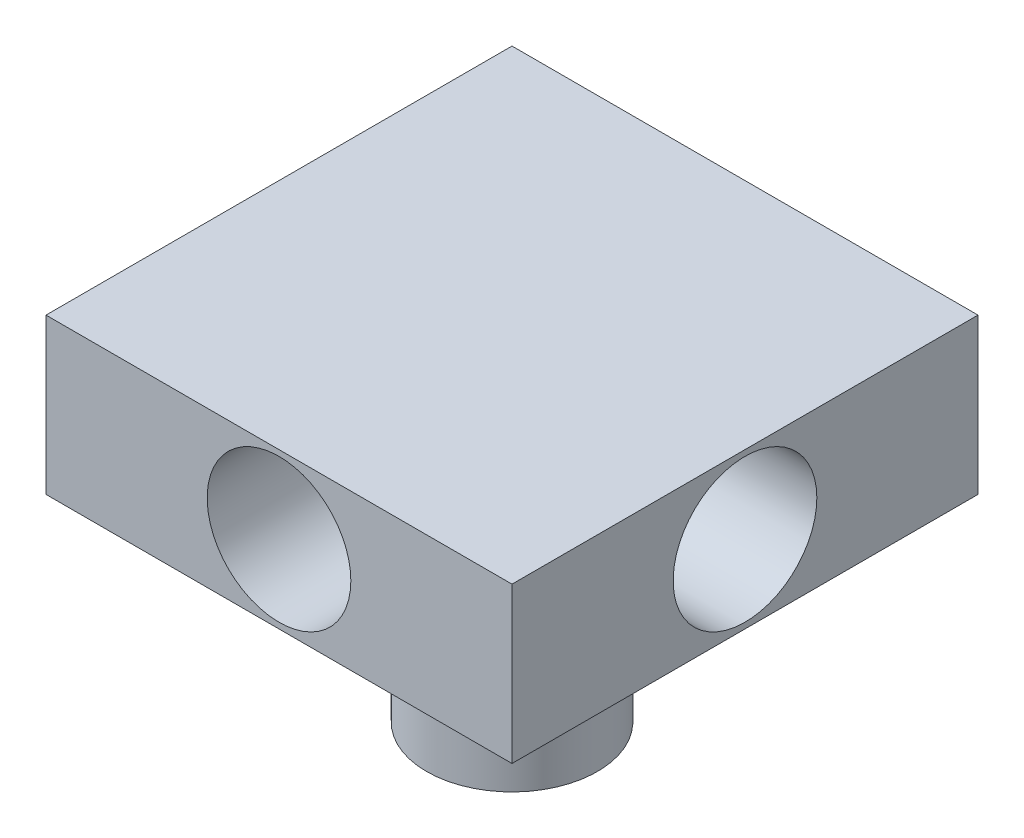
ISO-10303-21;
HEADER;
FILE_DESCRIPTION(('STEP AP214'),'2;1');
FILE_NAME('part.step','',(''),(''),'','','');
FILE_SCHEMA(('AUTOMOTIVE_DESIGN { 1 0 10303 214 1 1 1 1 }'));
ENDSEC;
DATA;
#1=APPLICATION_CONTEXT('core data for automotive mechanical design processes');
#2=APPLICATION_PROTOCOL_DEFINITION('international standard','automotive_design',2000,#1);
#3=PRODUCT_CONTEXT('',#1,'mechanical');
#4=PRODUCT('Part','Part','',(#3));
#5=PRODUCT_RELATED_PRODUCT_CATEGORY('part','',(#4));
#6=PRODUCT_DEFINITION_FORMATION('','',#4);
#7=PRODUCT_DEFINITION_CONTEXT('part definition',#1,'design');
#8=PRODUCT_DEFINITION('design','',#6,#7);
#9=PRODUCT_DEFINITION_SHAPE('','',#8);
#10=(LENGTH_UNIT() NAMED_UNIT(*) SI_UNIT(.MILLI.,.METRE.));
#11=(NAMED_UNIT(*) PLANE_ANGLE_UNIT() SI_UNIT($,.RADIAN.));
#12=(NAMED_UNIT(*) SI_UNIT($,.STERADIAN.) SOLID_ANGLE_UNIT());
#13=UNCERTAINTY_MEASURE_WITH_UNIT(LENGTH_MEASURE(1.E-05),#10,'distance_accuracy_value','');
#14=(GEOMETRIC_REPRESENTATION_CONTEXT(3) GLOBAL_UNCERTAINTY_ASSIGNED_CONTEXT((#13)) GLOBAL_UNIT_ASSIGNED_CONTEXT((#10,
#11,#12)) REPRESENTATION_CONTEXT('',''));
#15=CARTESIAN_POINT('',(0.,0.,0.));
#16=DIRECTION('',(0.,0.,1.));
#17=DIRECTION('',(1.,0.,0.));
#18=AXIS2_PLACEMENT_3D('',#15,#16,#17);
#19=CARTESIAN_POINT('',(0.,25.4,0.));
#20=DIRECTION('',(0.,-1.,0.));
#21=DIRECTION('',(0.,0.,-1.));
#22=AXIS2_PLACEMENT_3D('',#19,#20,#21);
#23=CYLINDRICAL_SURFACE('',#22,11.);
#24=CARTESIAN_POINT('',(0.,25.4,0.));
#25=DIRECTION('',(0.,1.,0.));
#26=DIRECTION('',(0.,0.,1.));
#27=AXIS2_PLACEMENT_3D('',#24,#25,#26);
#28=CIRCLE('',#27,11.);
#29=CARTESIAN_POINT('',(0.,25.4,11.));
#30=VERTEX_POINT('',#29);
#31=EDGE_CURVE('E11',#30,#30,#28,.T.);
#32=ORIENTED_EDGE('',*,*,#31,.F.);
#33=EDGE_LOOP('',(#32));
#34=FACE_BOUND('',#33,.T.);
#35=CARTESIAN_POINT('',(0.,0.,0.));
#36=DIRECTION('',(0.,1.,0.));
#37=DIRECTION('',(0.,0.,1.));
#38=AXIS2_PLACEMENT_3D('',#35,#36,#37);
#39=CIRCLE('',#38,11.);
#40=CARTESIAN_POINT('',(0.,0.,11.));
#41=VERTEX_POINT('',#40);
#42=EDGE_CURVE('E42',#41,#41,#39,.T.);
#43=ORIENTED_EDGE('',*,*,#42,.T.);
#44=EDGE_LOOP('',(#43));
#45=FACE_BOUND('',#44,.T.);
#46=ADVANCED_FACE('F39',(#34,#45),#23,.T.);
#47=CARTESIAN_POINT('',(0.,0.,0.));
#48=DIRECTION('',(0.,1.,0.));
#49=DIRECTION('',(0.,0.,1.));
#50=AXIS2_PLACEMENT_3D('',#47,#48,#49);
#51=PLANE('',#50);
#52=ORIENTED_EDGE('',*,*,#42,.F.);
#53=EDGE_LOOP('',(#52));
#54=FACE_BOUND('',#53,.T.);
#55=ADVANCED_FACE('F132',(#54),#51,.F.);
#56=CARTESIAN_POINT('',(-30.,45.4,30.));
#57=DIRECTION('',(1.,0.,0.));
#58=DIRECTION('',(0.,0.,-1.));
#59=AXIS2_PLACEMENT_3D('',#56,#57,#58);
#60=PLANE('',#59);
#61=CARTESIAN_POINT('',(-30.,35.4,0.));
#62=DIRECTION('',(-1.,0.,0.));
#63=DIRECTION('',(0.,0.,1.));
#64=AXIS2_PLACEMENT_3D('',#61,#62,#63);
#65=CIRCLE('',#64,9.25);
#66=CARTESIAN_POINT('',(-30.,35.4,9.25));
#67=VERTEX_POINT('',#66);
#68=EDGE_CURVE('E187',#67,#67,#65,.T.);
#69=ORIENTED_EDGE('',*,*,#68,.F.);
#70=EDGE_LOOP('',(#69));
#71=FACE_BOUND('',#70,.T.);
#72=DIRECTION('',(0.,0.,1.));
#73=VECTOR('',#72,1.);
#74=CARTESIAN_POINT('',(-30.,25.4,30.));
#75=LINE('',#74,#73);
#76=CARTESIAN_POINT('',(-30.,25.4,-30.));
#77=VERTEX_POINT('',#76);
#78=CARTESIAN_POINT('',(-30.,25.4,30.));
#79=VERTEX_POINT('',#78);
#80=EDGE_CURVE('E111',#77,#79,#75,.T.);
#81=ORIENTED_EDGE('',*,*,#80,.T.);
#82=DIRECTION('',(0.,-1.,0.));
#83=VECTOR('',#82,1.);
#84=CARTESIAN_POINT('',(-30.,45.4,30.));
#85=LINE('',#84,#83);
#86=CARTESIAN_POINT('',(-30.,45.4,30.));
#87=VERTEX_POINT('',#86);
#88=EDGE_CURVE('E100',#87,#79,#85,.T.);
#89=ORIENTED_EDGE('',*,*,#88,.F.);
#90=DIRECTION('',(0.,0.,1.));
#91=VECTOR('',#90,1.);
#92=CARTESIAN_POINT('',(-30.,45.4,30.));
#93=LINE('',#92,#91);
#94=CARTESIAN_POINT('',(-30.,45.4,-30.));
#95=VERTEX_POINT('',#94);
#96=EDGE_CURVE('E92',#95,#87,#93,.T.);
#97=ORIENTED_EDGE('',*,*,#96,.F.);
#98=DIRECTION('',(0.,-1.,0.));
#99=VECTOR('',#98,1.);
#100=CARTESIAN_POINT('',(-30.,45.4,-30.));
#101=LINE('',#100,#99);
#102=EDGE_CURVE('E107',#95,#77,#101,.T.);
#103=ORIENTED_EDGE('',*,*,#102,.T.);
#104=EDGE_LOOP('',(#81,#89,#97,#103));
#105=FACE_BOUND('',#104,.T.);
#106=ADVANCED_FACE('F134',(#71,#105),#60,.F.);
#107=CARTESIAN_POINT('',(30.,45.4,30.));
#108=DIRECTION('',(0.,0.,-1.));
#109=DIRECTION('',(-1.,0.,0.));
#110=AXIS2_PLACEMENT_3D('',#107,#108,#109);
#111=PLANE('',#110);
#112=CARTESIAN_POINT('',(0.,35.4,30.));
#113=DIRECTION('',(0.,0.,1.));
#114=DIRECTION('',(1.,0.,0.));
#115=AXIS2_PLACEMENT_3D('',#112,#113,#114);
#116=CIRCLE('',#115,9.25);
#117=CARTESIAN_POINT('',(9.25,35.4,30.));
#118=VERTEX_POINT('',#117);
#119=EDGE_CURVE('E200',#118,#118,#116,.T.);
#120=ORIENTED_EDGE('',*,*,#119,.F.);
#121=EDGE_LOOP('',(#120));
#122=FACE_BOUND('',#121,.T.);
#123=DIRECTION('',(1.,0.,0.));
#124=VECTOR('',#123,1.);
#125=CARTESIAN_POINT('',(30.,25.4,30.));
#126=LINE('',#125,#124);
#127=CARTESIAN_POINT('',(30.,25.4,30.));
#128=VERTEX_POINT('',#127);
#129=EDGE_CURVE('E98',#79,#128,#126,.T.);
#130=ORIENTED_EDGE('',*,*,#129,.T.);
#131=DIRECTION('',(0.,-1.,0.));
#132=VECTOR('',#131,1.);
#133=CARTESIAN_POINT('',(30.,45.4,30.));
#134=LINE('',#133,#132);
#135=CARTESIAN_POINT('',(30.,45.4,30.));
#136=VERTEX_POINT('',#135);
#137=EDGE_CURVE('E96',#136,#128,#134,.T.);
#138=ORIENTED_EDGE('',*,*,#137,.F.);
#139=DIRECTION('',(1.,0.,0.));
#140=VECTOR('',#139,1.);
#141=CARTESIAN_POINT('',(30.,45.4,30.));
#142=LINE('',#141,#140);
#143=EDGE_CURVE('E87',#87,#136,#142,.T.);
#144=ORIENTED_EDGE('',*,*,#143,.F.);
#145=ORIENTED_EDGE('',*,*,#88,.T.);
#146=EDGE_LOOP('',(#130,#138,#144,#145));
#147=FACE_BOUND('',#146,.T.);
#148=ADVANCED_FACE('F97',(#122,#147),#111,.F.);
#149=CARTESIAN_POINT('',(30.,45.4,30.));
#150=DIRECTION('',(-1.,0.,0.));
#151=DIRECTION('',(0.,0.,1.));
#152=AXIS2_PLACEMENT_3D('',#149,#150,#151);
#153=PLANE('',#152);
#154=CARTESIAN_POINT('',(30.,35.4,0.));
#155=DIRECTION('',(1.,0.,0.));
#156=DIRECTION('',(0.,0.,-1.));
#157=AXIS2_PLACEMENT_3D('',#154,#155,#156);
#158=CIRCLE('',#157,9.25);
#159=CARTESIAN_POINT('',(30.,35.4,-9.25));
#160=VERTEX_POINT('',#159);
#161=EDGE_CURVE('E188',#160,#160,#158,.T.);
#162=ORIENTED_EDGE('',*,*,#161,.F.);
#163=EDGE_LOOP('',(#162));
#164=FACE_BOUND('',#163,.T.);
#165=DIRECTION('',(0.,0.,-1.));
#166=VECTOR('',#165,1.);
#167=CARTESIAN_POINT('',(30.,25.4,30.));
#168=LINE('',#167,#166);
#169=CARTESIAN_POINT('',(30.,25.4,-30.));
#170=VERTEX_POINT('',#169);
#171=EDGE_CURVE('E73',#128,#170,#168,.T.);
#172=ORIENTED_EDGE('',*,*,#171,.T.);
#173=DIRECTION('',(0.,-1.,0.));
#174=VECTOR('',#173,1.);
#175=CARTESIAN_POINT('',(30.,45.4,-30.));
#176=LINE('',#175,#174);
#177=CARTESIAN_POINT('',(30.,45.4,-30.));
#178=VERTEX_POINT('',#177);
#179=EDGE_CURVE('E101',#178,#170,#176,.T.);
#180=ORIENTED_EDGE('',*,*,#179,.F.);
#181=DIRECTION('',(0.,0.,-1.));
#182=VECTOR('',#181,1.);
#183=CARTESIAN_POINT('',(30.,45.4,30.));
#184=LINE('',#183,#182);
#185=EDGE_CURVE('E90',#136,#178,#184,.T.);
#186=ORIENTED_EDGE('',*,*,#185,.F.);
#187=ORIENTED_EDGE('',*,*,#137,.T.);
#188=EDGE_LOOP('',(#172,#180,#186,#187));
#189=FACE_BOUND('',#188,.T.);
#190=ADVANCED_FACE('F103',(#164,#189),#153,.F.);
#191=CARTESIAN_POINT('',(30.,45.4,-30.));
#192=DIRECTION('',(0.,0.,1.));
#193=DIRECTION('',(1.,0.,0.));
#194=AXIS2_PLACEMENT_3D('',#191,#192,#193);
#195=PLANE('',#194);
#196=DIRECTION('',(-1.,0.,0.));
#197=VECTOR('',#196,1.);
#198=CARTESIAN_POINT('',(30.,25.4,-30.));
#199=LINE('',#198,#197);
#200=EDGE_CURVE('E79',#170,#77,#199,.T.);
#201=ORIENTED_EDGE('',*,*,#200,.T.);
#202=ORIENTED_EDGE('',*,*,#102,.F.);
#203=DIRECTION('',(-1.,0.,0.));
#204=VECTOR('',#203,1.);
#205=CARTESIAN_POINT('',(30.,45.4,-30.));
#206=LINE('',#205,#204);
#207=EDGE_CURVE('E56',#178,#95,#206,.T.);
#208=ORIENTED_EDGE('',*,*,#207,.F.);
#209=ORIENTED_EDGE('',*,*,#179,.T.);
#210=EDGE_LOOP('',(#201,#202,#208,#209));
#211=FACE_BOUND('',#210,.T.);
#212=ADVANCED_FACE('F148',(#211),#195,.F.);
#213=CARTESIAN_POINT('',(0.,45.4,0.));
#214=DIRECTION('',(0.,1.,0.));
#215=DIRECTION('',(0.,0.,1.));
#216=AXIS2_PLACEMENT_3D('',#213,#214,#215);
#217=PLANE('',#216);
#218=ORIENTED_EDGE('',*,*,#96,.T.);
#219=ORIENTED_EDGE('',*,*,#143,.T.);
#220=ORIENTED_EDGE('',*,*,#185,.T.);
#221=ORIENTED_EDGE('',*,*,#207,.T.);
#222=EDGE_LOOP('',(#218,#219,#220,#221));
#223=FACE_BOUND('',#222,.T.);
#224=ADVANCED_FACE('F88',(#223),#217,.T.);
#225=CARTESIAN_POINT('',(0.,25.4,0.));
#226=DIRECTION('',(0.,1.,0.));
#227=DIRECTION('',(0.,0.,1.));
#228=AXIS2_PLACEMENT_3D('',#225,#226,#227);
#229=PLANE('',#228);
#230=ORIENTED_EDGE('',*,*,#31,.T.);
#231=EDGE_LOOP('',(#230));
#232=FACE_BOUND('',#231,.T.);
#233=ORIENTED_EDGE('',*,*,#80,.F.);
#234=ORIENTED_EDGE('',*,*,#200,.F.);
#235=ORIENTED_EDGE('',*,*,#171,.F.);
#236=ORIENTED_EDGE('',*,*,#129,.F.);
#237=EDGE_LOOP('',(#233,#234,#235,#236));
#238=FACE_BOUND('',#237,.T.);
#239=ADVANCED_FACE('F152',(#232,#238),#229,.F.);
#240=CARTESIAN_POINT('',(0.,35.4,10.));
#241=DIRECTION('',(0.,0.,1.));
#242=DIRECTION('',(1.,0.,0.));
#243=AXIS2_PLACEMENT_3D('',#240,#241,#242);
#244=CYLINDRICAL_SURFACE('',#243,9.25);
#245=CARTESIAN_POINT('',(0.,35.4,10.));
#246=DIRECTION('',(0.,0.,1.));
#247=DIRECTION('',(1.,0.,0.));
#248=AXIS2_PLACEMENT_3D('',#245,#246,#247);
#249=CIRCLE('',#248,9.25);
#250=CARTESIAN_POINT('',(9.25,35.4,10.));
#251=VERTEX_POINT('',#250);
#252=EDGE_CURVE('E115',#251,#251,#249,.T.);
#253=ORIENTED_EDGE('',*,*,#252,.F.);
#254=EDGE_LOOP('',(#253));
#255=FACE_BOUND('',#254,.T.);
#256=ORIENTED_EDGE('',*,*,#119,.T.);
#257=EDGE_LOOP('',(#256));
#258=FACE_BOUND('',#257,.T.);
#259=ADVANCED_FACE('F155',(#255,#258),#244,.F.);
#260=CARTESIAN_POINT('',(0.,35.4,10.));
#261=DIRECTION('',(0.,0.,1.));
#262=DIRECTION('',(1.,0.,0.));
#263=AXIS2_PLACEMENT_3D('',#260,#261,#262);
#264=PLANE('',#263);
#265=ORIENTED_EDGE('',*,*,#252,.T.);
#266=EDGE_LOOP('',(#265));
#267=FACE_BOUND('',#266,.T.);
#268=ADVANCED_FACE('F161',(#267),#264,.T.);
#269=CARTESIAN_POINT('',(-10.,35.4,0.));
#270=DIRECTION('',(-1.,0.,0.));
#271=DIRECTION('',(0.,0.,1.));
#272=AXIS2_PLACEMENT_3D('',#269,#270,#271);
#273=CYLINDRICAL_SURFACE('',#272,9.25);
#274=CARTESIAN_POINT('',(-10.,35.4,0.));
#275=DIRECTION('',(-1.,0.,0.));
#276=DIRECTION('',(0.,0.,1.));
#277=AXIS2_PLACEMENT_3D('',#274,#275,#276);
#278=CIRCLE('',#277,9.25);
#279=CARTESIAN_POINT('',(-10.,35.4,9.25));
#280=VERTEX_POINT('',#279);
#281=EDGE_CURVE('E193',#280,#280,#278,.T.);
#282=ORIENTED_EDGE('',*,*,#281,.F.);
#283=EDGE_LOOP('',(#282));
#284=FACE_BOUND('',#283,.T.);
#285=ORIENTED_EDGE('',*,*,#68,.T.);
#286=EDGE_LOOP('',(#285));
#287=FACE_BOUND('',#286,.T.);
#288=ADVANCED_FACE('F165',(#284,#287),#273,.F.);
#289=CARTESIAN_POINT('',(-10.,35.4,0.));
#290=DIRECTION('',(-1.,0.,0.));
#291=DIRECTION('',(0.,0.,1.));
#292=AXIS2_PLACEMENT_3D('',#289,#290,#291);
#293=PLANE('',#292);
#294=ORIENTED_EDGE('',*,*,#281,.T.);
#295=EDGE_LOOP('',(#294));
#296=FACE_BOUND('',#295,.T.);
#297=ADVANCED_FACE('F169',(#296),#293,.T.);
#298=CARTESIAN_POINT('',(10.,35.4,0.));
#299=DIRECTION('',(1.,0.,0.));
#300=DIRECTION('',(0.,0.,-1.));
#301=AXIS2_PLACEMENT_3D('',#298,#299,#300);
#302=CYLINDRICAL_SURFACE('',#301,9.25);
#303=CARTESIAN_POINT('',(10.,35.4,0.));
#304=DIRECTION('',(1.,0.,0.));
#305=DIRECTION('',(0.,0.,-1.));
#306=AXIS2_PLACEMENT_3D('',#303,#304,#305);
#307=CIRCLE('',#306,9.25);
#308=CARTESIAN_POINT('',(10.,35.4,-9.25));
#309=VERTEX_POINT('',#308);
#310=EDGE_CURVE('E185',#309,#309,#307,.T.);
#311=ORIENTED_EDGE('',*,*,#310,.F.);
#312=EDGE_LOOP('',(#311));
#313=FACE_BOUND('',#312,.T.);
#314=ORIENTED_EDGE('',*,*,#161,.T.);
#315=EDGE_LOOP('',(#314));
#316=FACE_BOUND('',#315,.T.);
#317=ADVANCED_FACE('F173',(#313,#316),#302,.F.);
#318=CARTESIAN_POINT('',(10.,35.4,0.));
#319=DIRECTION('',(1.,0.,0.));
#320=DIRECTION('',(0.,0.,-1.));
#321=AXIS2_PLACEMENT_3D('',#318,#319,#320);
#322=PLANE('',#321);
#323=ORIENTED_EDGE('',*,*,#310,.T.);
#324=EDGE_LOOP('',(#323));
#325=FACE_BOUND('',#324,.T.);
#326=ADVANCED_FACE('F177',(#325),#322,.T.);
#327=CLOSED_SHELL('',(#46,#55,#106,#148,#190,#212,#224,#239,#259,#268,#288,#297,#317,#326));
#328=MANIFOLD_SOLID_BREP('B2',#327);
#329=ADVANCED_BREP_SHAPE_REPRESENTATION('',(#18,#328),#14);
#330=SHAPE_DEFINITION_REPRESENTATION(#9,#329);
ENDSEC;
END-ISO-10303-21;
